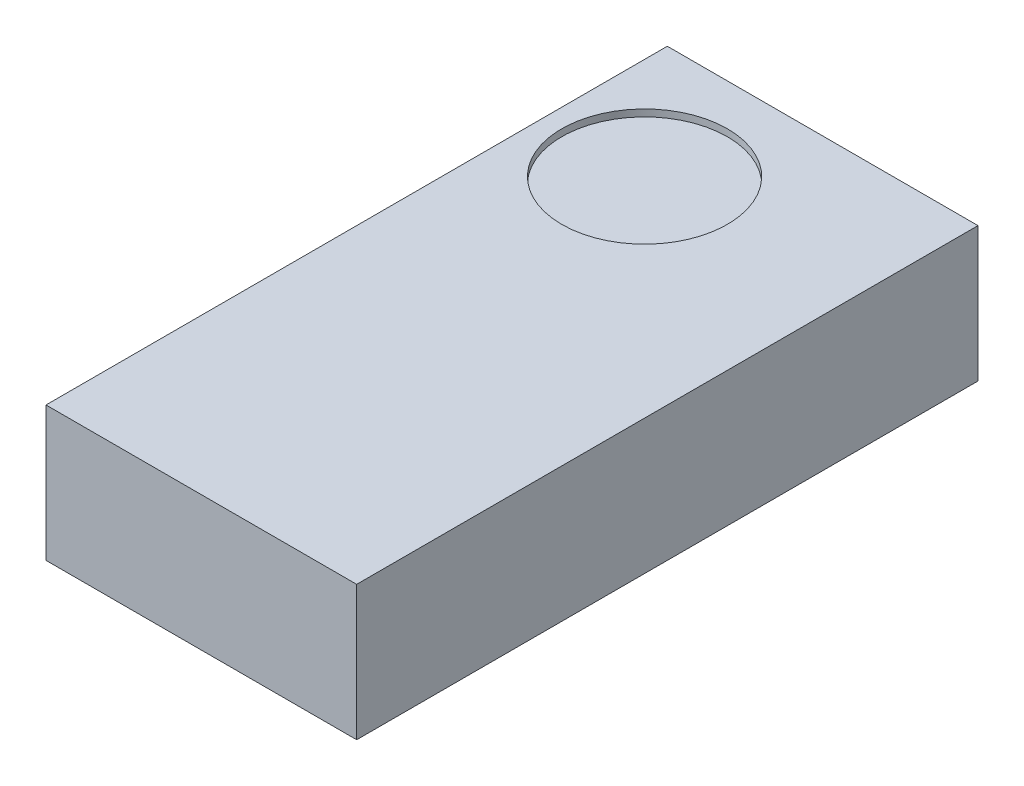
ISO-10303-21;
HEADER;
FILE_DESCRIPTION(('STEP AP214'),'2;1');
FILE_NAME('part.step','',(''),(''),'','','');
FILE_SCHEMA(('AUTOMOTIVE_DESIGN { 1 0 10303 214 1 1 1 1 }'));
ENDSEC;
DATA;
#1=APPLICATION_CONTEXT('core data for automotive mechanical design processes');
#2=APPLICATION_PROTOCOL_DEFINITION('international standard','automotive_design',2000,#1);
#3=PRODUCT_CONTEXT('',#1,'mechanical');
#4=PRODUCT('Part','Part','',(#3));
#5=PRODUCT_RELATED_PRODUCT_CATEGORY('part','',(#4));
#6=PRODUCT_DEFINITION_FORMATION('','',#4);
#7=PRODUCT_DEFINITION_CONTEXT('part definition',#1,'design');
#8=PRODUCT_DEFINITION('design','',#6,#7);
#9=PRODUCT_DEFINITION_SHAPE('','',#8);
#10=(LENGTH_UNIT() NAMED_UNIT(*) SI_UNIT(.MILLI.,.METRE.));
#11=(NAMED_UNIT(*) PLANE_ANGLE_UNIT() SI_UNIT($,.RADIAN.));
#12=(NAMED_UNIT(*) SI_UNIT($,.STERADIAN.) SOLID_ANGLE_UNIT());
#13=UNCERTAINTY_MEASURE_WITH_UNIT(LENGTH_MEASURE(1.E-05),#10,'distance_accuracy_value','');
#14=(GEOMETRIC_REPRESENTATION_CONTEXT(3) GLOBAL_UNCERTAINTY_ASSIGNED_CONTEXT((#13)) GLOBAL_UNIT_ASSIGNED_CONTEXT((#10,
#11,#12)) REPRESENTATION_CONTEXT('',''));
#15=CARTESIAN_POINT('',(0.,0.,0.));
#16=DIRECTION('',(0.,0.,1.));
#17=DIRECTION('',(1.,0.,0.));
#18=AXIS2_PLACEMENT_3D('',#15,#16,#17);
#19=CARTESIAN_POINT('',(57.15,49.53,-114.3));
#20=DIRECTION('',(-1.,0.,0.));
#21=DIRECTION('',(0.,0.,1.));
#22=AXIS2_PLACEMENT_3D('',#19,#20,#21);
#23=PLANE('',#22);
#24=DIRECTION('',(0.,0.,-1.));
#25=VECTOR('',#24,1.);
#26=CARTESIAN_POINT('',(57.15,0.,-114.3));
#27=LINE('',#26,#25);
#28=CARTESIAN_POINT('',(57.15,0.,114.3));
#29=VERTEX_POINT('',#28);
#30=CARTESIAN_POINT('',(57.15,0.,-114.3));
#31=VERTEX_POINT('',#30);
#32=EDGE_CURVE('E96',#29,#31,#27,.T.);
#33=ORIENTED_EDGE('',*,*,#32,.T.);
#34=DIRECTION('',(0.,-1.,0.));
#35=VECTOR('',#34,1.);
#36=CARTESIAN_POINT('',(57.15,49.53,-114.3));
#37=LINE('',#36,#35);
#38=CARTESIAN_POINT('',(57.15,49.53,-114.3));
#39=VERTEX_POINT('',#38);
#40=EDGE_CURVE('E11',#39,#31,#37,.T.);
#41=ORIENTED_EDGE('',*,*,#40,.F.);
#42=DIRECTION('',(0.,0.,-1.));
#43=VECTOR('',#42,1.);
#44=CARTESIAN_POINT('',(57.15,49.53,-114.3));
#45=LINE('',#44,#43);
#46=CARTESIAN_POINT('',(57.15,49.53,114.3));
#47=VERTEX_POINT('',#46);
#48=EDGE_CURVE('E84',#47,#39,#45,.T.);
#49=ORIENTED_EDGE('',*,*,#48,.F.);
#50=DIRECTION('',(0.,-1.,0.));
#51=VECTOR('',#50,1.);
#52=CARTESIAN_POINT('',(57.15,49.53,114.3));
#53=LINE('',#52,#51);
#54=EDGE_CURVE('E92',#47,#29,#53,.T.);
#55=ORIENTED_EDGE('',*,*,#54,.T.);
#56=EDGE_LOOP('',(#33,#41,#49,#55));
#57=FACE_BOUND('',#56,.T.);
#58=ADVANCED_FACE('F33',(#57),#23,.F.);
#59=CARTESIAN_POINT('',(-57.15,49.53,-114.3));
#60=DIRECTION('',(0.,0.,1.));
#61=DIRECTION('',(1.,0.,0.));
#62=AXIS2_PLACEMENT_3D('',#59,#60,#61);
#63=PLANE('',#62);
#64=DIRECTION('',(-1.,0.,0.));
#65=VECTOR('',#64,1.);
#66=CARTESIAN_POINT('',(-57.15,0.,-114.3));
#67=LINE('',#66,#65);
#68=CARTESIAN_POINT('',(-57.15,0.,-114.3));
#69=VERTEX_POINT('',#68);
#70=EDGE_CURVE('E88',#31,#69,#67,.T.);
#71=ORIENTED_EDGE('',*,*,#70,.T.);
#72=DIRECTION('',(0.,-1.,0.));
#73=VECTOR('',#72,1.);
#74=CARTESIAN_POINT('',(-57.15,49.53,-114.3));
#75=LINE('',#74,#73);
#76=CARTESIAN_POINT('',(-57.15,49.53,-114.3));
#77=VERTEX_POINT('',#76);
#78=EDGE_CURVE('E41',#77,#69,#75,.T.);
#79=ORIENTED_EDGE('',*,*,#78,.F.);
#80=DIRECTION('',(-1.,0.,0.));
#81=VECTOR('',#80,1.);
#82=CARTESIAN_POINT('',(-57.15,49.53,-114.3));
#83=LINE('',#82,#81);
#84=EDGE_CURVE('E79',#39,#77,#83,.T.);
#85=ORIENTED_EDGE('',*,*,#84,.F.);
#86=ORIENTED_EDGE('',*,*,#40,.T.);
#87=EDGE_LOOP('',(#71,#79,#85,#86));
#88=FACE_BOUND('',#87,.T.);
#89=ADVANCED_FACE('F87',(#88),#63,.F.);
#90=CARTESIAN_POINT('',(-57.15,49.53,-114.3));
#91=DIRECTION('',(1.,0.,0.));
#92=DIRECTION('',(0.,0.,-1.));
#93=AXIS2_PLACEMENT_3D('',#90,#91,#92);
#94=PLANE('',#93);
#95=DIRECTION('',(0.,0.,1.));
#96=VECTOR('',#95,1.);
#97=CARTESIAN_POINT('',(-57.15,0.,-114.3));
#98=LINE('',#97,#96);
#99=CARTESIAN_POINT('',(-57.15,0.,114.3));
#100=VERTEX_POINT('',#99);
#101=EDGE_CURVE('E66',#69,#100,#98,.T.);
#102=ORIENTED_EDGE('',*,*,#101,.T.);
#103=DIRECTION('',(0.,-1.,0.));
#104=VECTOR('',#103,1.);
#105=CARTESIAN_POINT('',(-57.15,49.53,114.3));
#106=LINE('',#105,#104);
#107=CARTESIAN_POINT('',(-57.15,49.53,114.3));
#108=VERTEX_POINT('',#107);
#109=EDGE_CURVE('E89',#108,#100,#106,.T.);
#110=ORIENTED_EDGE('',*,*,#109,.F.);
#111=DIRECTION('',(0.,0.,1.));
#112=VECTOR('',#111,1.);
#113=CARTESIAN_POINT('',(-57.15,49.53,-114.3));
#114=LINE('',#113,#112);
#115=EDGE_CURVE('E82',#77,#108,#114,.T.);
#116=ORIENTED_EDGE('',*,*,#115,.F.);
#117=ORIENTED_EDGE('',*,*,#78,.T.);
#118=EDGE_LOOP('',(#102,#110,#116,#117));
#119=FACE_BOUND('',#118,.T.);
#120=ADVANCED_FACE('F90',(#119),#94,.F.);
#121=CARTESIAN_POINT('',(-57.15,49.53,114.3));
#122=DIRECTION('',(0.,0.,-1.));
#123=DIRECTION('',(-1.,0.,0.));
#124=AXIS2_PLACEMENT_3D('',#121,#122,#123);
#125=PLANE('',#124);
#126=DIRECTION('',(1.,0.,0.));
#127=VECTOR('',#126,1.);
#128=CARTESIAN_POINT('',(-57.15,0.,114.3));
#129=LINE('',#128,#127);
#130=EDGE_CURVE('E72',#100,#29,#129,.T.);
#131=ORIENTED_EDGE('',*,*,#130,.T.);
#132=ORIENTED_EDGE('',*,*,#54,.F.);
#133=DIRECTION('',(1.,0.,0.));
#134=VECTOR('',#133,1.);
#135=CARTESIAN_POINT('',(-57.15,49.53,114.3));
#136=LINE('',#135,#134);
#137=EDGE_CURVE('E49',#108,#47,#136,.T.);
#138=ORIENTED_EDGE('',*,*,#137,.F.);
#139=ORIENTED_EDGE('',*,*,#109,.T.);
#140=EDGE_LOOP('',(#131,#132,#138,#139));
#141=FACE_BOUND('',#140,.T.);
#142=ADVANCED_FACE('F104',(#141),#125,.F.);
#143=CARTESIAN_POINT('',(0.,49.53,0.));
#144=DIRECTION('',(0.,1.,0.));
#145=DIRECTION('',(0.,0.,1.));
#146=AXIS2_PLACEMENT_3D('',#143,#144,#145);
#147=PLANE('',#146);
#148=CARTESIAN_POINT('',(-19.812,49.53,-68.58));
#149=DIRECTION('',(0.,1.,0.));
#150=DIRECTION('',(0.,0.,1.));
#151=AXIS2_PLACEMENT_3D('',#148,#149,#150);
#152=CIRCLE('',#151,30.48);
#153=CARTESIAN_POINT('',(-19.812,49.53,-38.1));
#154=VERTEX_POINT('',#153);
#155=EDGE_CURVE('E110',#154,#154,#152,.T.);
#156=ORIENTED_EDGE('',*,*,#155,.F.);
#157=EDGE_LOOP('',(#156));
#158=FACE_BOUND('',#157,.T.);
#159=ORIENTED_EDGE('',*,*,#48,.T.);
#160=ORIENTED_EDGE('',*,*,#84,.T.);
#161=ORIENTED_EDGE('',*,*,#115,.T.);
#162=ORIENTED_EDGE('',*,*,#137,.T.);
#163=EDGE_LOOP('',(#159,#160,#161,#162));
#164=FACE_BOUND('',#163,.T.);
#165=ADVANCED_FACE('F80',(#158,#164),#147,.T.);
#166=CARTESIAN_POINT('',(0.,0.,0.));
#167=DIRECTION('',(0.,1.,0.));
#168=DIRECTION('',(0.,0.,1.));
#169=AXIS2_PLACEMENT_3D('',#166,#167,#168);
#170=PLANE('',#169);
#171=ORIENTED_EDGE('',*,*,#32,.F.);
#172=ORIENTED_EDGE('',*,*,#130,.F.);
#173=ORIENTED_EDGE('',*,*,#101,.F.);
#174=ORIENTED_EDGE('',*,*,#70,.F.);
#175=EDGE_LOOP('',(#171,#172,#173,#174));
#176=FACE_BOUND('',#175,.T.);
#177=ADVANCED_FACE('F107',(#176),#170,.F.);
#178=CARTESIAN_POINT('',(-19.812,46.99,-68.58));
#179=DIRECTION('',(0.,1.,0.));
#180=DIRECTION('',(0.,0.,1.));
#181=AXIS2_PLACEMENT_3D('',#178,#179,#180);
#182=CYLINDRICAL_SURFACE('',#181,30.48);
#183=CARTESIAN_POINT('',(-19.812,46.99,-68.58));
#184=DIRECTION('',(0.,1.,0.));
#185=DIRECTION('',(0.,0.,1.));
#186=AXIS2_PLACEMENT_3D('',#183,#184,#185);
#187=CIRCLE('',#186,30.48);
#188=CARTESIAN_POINT('',(-19.812,46.99,-38.1));
#189=VERTEX_POINT('',#188);
#190=EDGE_CURVE('E99',#189,#189,#187,.T.);
#191=ORIENTED_EDGE('',*,*,#190,.F.);
#192=EDGE_LOOP('',(#191));
#193=FACE_BOUND('',#192,.T.);
#194=ORIENTED_EDGE('',*,*,#155,.T.);
#195=EDGE_LOOP('',(#194));
#196=FACE_BOUND('',#195,.T.);
#197=ADVANCED_FACE('F118',(#193,#196),#182,.F.);
#198=CARTESIAN_POINT('',(-19.812,46.99,-68.58));
#199=DIRECTION('',(0.,1.,0.));
#200=DIRECTION('',(0.,0.,1.));
#201=AXIS2_PLACEMENT_3D('',#198,#199,#200);
#202=PLANE('',#201);
#203=ORIENTED_EDGE('',*,*,#190,.T.);
#204=EDGE_LOOP('',(#203));
#205=FACE_BOUND('',#204,.T.);
#206=ADVANCED_FACE('F116',(#205),#202,.T.);
#207=CLOSED_SHELL('',(#58,#89,#120,#142,#165,#177,#197,#206));
#208=MANIFOLD_SOLID_BREP('B2',#207);
#209=ADVANCED_BREP_SHAPE_REPRESENTATION('',(#18,#208),#14);
#210=SHAPE_DEFINITION_REPRESENTATION(#9,#209);
ENDSEC;
END-ISO-10303-21;
